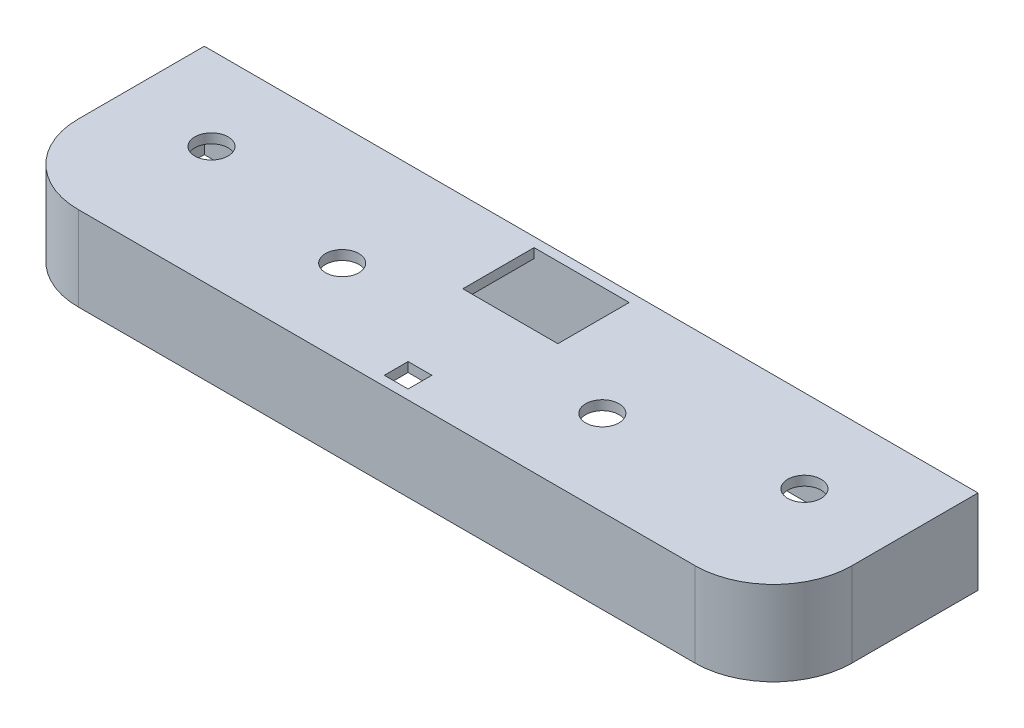
ISO-10303-21;
HEADER;
FILE_DESCRIPTION(('STEP AP214'),'2;1');
FILE_NAME('part.step','',(''),(''),'','','');
FILE_SCHEMA(('AUTOMOTIVE_DESIGN { 1 0 10303 214 1 1 1 1 }'));
ENDSEC;
DATA;
#1=APPLICATION_CONTEXT('core data for automotive mechanical design processes');
#2=APPLICATION_PROTOCOL_DEFINITION('international standard','automotive_design',2000,#1);
#3=PRODUCT_CONTEXT('',#1,'mechanical');
#4=PRODUCT('Part','Part','',(#3));
#5=PRODUCT_RELATED_PRODUCT_CATEGORY('part','',(#4));
#6=PRODUCT_DEFINITION_FORMATION('','',#4);
#7=PRODUCT_DEFINITION_CONTEXT('part definition',#1,'design');
#8=PRODUCT_DEFINITION('design','',#6,#7);
#9=PRODUCT_DEFINITION_SHAPE('','',#8);
#10=(LENGTH_UNIT() NAMED_UNIT(*) SI_UNIT(.MILLI.,.METRE.));
#11=(NAMED_UNIT(*) PLANE_ANGLE_UNIT() SI_UNIT($,.RADIAN.));
#12=(NAMED_UNIT(*) SI_UNIT($,.STERADIAN.) SOLID_ANGLE_UNIT());
#13=UNCERTAINTY_MEASURE_WITH_UNIT(LENGTH_MEASURE(1.E-05),#10,'distance_accuracy_value','');
#14=(GEOMETRIC_REPRESENTATION_CONTEXT(3) GLOBAL_UNCERTAINTY_ASSIGNED_CONTEXT((#13)) GLOBAL_UNIT_ASSIGNED_CONTEXT((#10,
#11,#12)) REPRESENTATION_CONTEXT('',''));
#15=CARTESIAN_POINT('',(0.,0.,0.));
#16=DIRECTION('',(0.,0.,1.));
#17=DIRECTION('',(1.,0.,0.));
#18=AXIS2_PLACEMENT_3D('',#15,#16,#17);
#19=CARTESIAN_POINT('',(0.,0.,0.));
#20=DIRECTION('',(0.,-1.,0.));
#21=DIRECTION('',(0.,0.,-1.));
#22=AXIS2_PLACEMENT_3D('',#19,#20,#21);
#23=PLANE('',#22);
#24=DIRECTION('',(0.,0.,-1.));
#25=VECTOR('',#24,1.);
#26=CARTESIAN_POINT('',(81.35,0.,21.5));
#27=LINE('',#26,#25);
#28=CARTESIAN_POINT('',(81.35,0.,5.));
#29=VERTEX_POINT('',#28);
#30=CARTESIAN_POINT('',(81.35,0.,-21.5));
#31=VERTEX_POINT('',#30);
#32=EDGE_CURVE('E259',#29,#31,#27,.T.);
#33=ORIENTED_EDGE('',*,*,#32,.F.);
#34=CARTESIAN_POINT('',(64.85,0.,5.));
#35=DIRECTION('',(0.,-1.,0.));
#36=DIRECTION('',(0.,0.,-1.));
#37=AXIS2_PLACEMENT_3D('',#34,#35,#36);
#38=CIRCLE('',#37,16.5);
#39=CARTESIAN_POINT('',(64.85,0.,21.5));
#40=VERTEX_POINT('',#39);
#41=EDGE_CURVE('E317',#29,#40,#38,.T.);
#42=ORIENTED_EDGE('',*,*,#41,.T.);
#43=DIRECTION('',(1.,0.,0.));
#44=VECTOR('',#43,1.);
#45=CARTESIAN_POINT('',(-81.35,0.,21.5));
#46=LINE('',#45,#44);
#47=CARTESIAN_POINT('',(-64.85,0.,21.5));
#48=VERTEX_POINT('',#47);
#49=EDGE_CURVE('E290',#48,#40,#46,.T.);
#50=ORIENTED_EDGE('',*,*,#49,.F.);
#51=CARTESIAN_POINT('',(-64.85,0.,5.));
#52=DIRECTION('',(0.,-1.,0.));
#53=DIRECTION('',(0.,0.,-1.));
#54=AXIS2_PLACEMENT_3D('',#51,#52,#53);
#55=CIRCLE('',#54,16.5);
#56=CARTESIAN_POINT('',(-81.35,0.,5.));
#57=VERTEX_POINT('',#56);
#58=EDGE_CURVE('E315',#48,#57,#55,.T.);
#59=ORIENTED_EDGE('',*,*,#58,.T.);
#60=DIRECTION('',(0.,0.,1.));
#61=VECTOR('',#60,1.);
#62=CARTESIAN_POINT('',(-81.35,0.,21.5));
#63=LINE('',#62,#61);
#64=CARTESIAN_POINT('',(-81.35,0.,-21.5));
#65=VERTEX_POINT('',#64);
#66=EDGE_CURVE('E302',#65,#57,#63,.T.);
#67=ORIENTED_EDGE('',*,*,#66,.F.);
#68=DIRECTION('',(-1.,0.,0.));
#69=VECTOR('',#68,1.);
#70=CARTESIAN_POINT('',(-81.35,0.,-21.5));
#71=LINE('',#70,#69);
#72=EDGE_CURVE('E300',#31,#65,#71,.T.);
#73=ORIENTED_EDGE('',*,*,#72,.F.);
#74=EDGE_LOOP('',(#33,#42,#50,#59,#67,#73));
#75=FACE_BOUND('',#74,.T.);
#76=CARTESIAN_POINT('',(64.85,0.,5.));
#77=DIRECTION('',(0.,-1.,0.));
#78=DIRECTION('',(0.,0.,-1.));
#79=AXIS2_PLACEMENT_3D('',#76,#77,#78);
#80=CIRCLE('',#79,14.5);
#81=CARTESIAN_POINT('',(79.35,0.,5.));
#82=VERTEX_POINT('',#81);
#83=CARTESIAN_POINT('',(64.85,0.,19.5));
#84=VERTEX_POINT('',#83);
#85=EDGE_CURVE('E273',#82,#84,#80,.T.);
#86=ORIENTED_EDGE('',*,*,#85,.F.);
#87=DIRECTION('',(0.,0.,-1.));
#88=VECTOR('',#87,1.);
#89=CARTESIAN_POINT('',(79.35,0.,0.));
#90=LINE('',#89,#88);
#91=CARTESIAN_POINT('',(79.35,0.,-19.5));
#92=VERTEX_POINT('',#91);
#93=EDGE_CURVE('E274',#82,#92,#90,.T.);
#94=ORIENTED_EDGE('',*,*,#93,.T.);
#95=DIRECTION('',(-1.,0.,0.));
#96=VECTOR('',#95,1.);
#97=CARTESIAN_POINT('',(0.,0.,-19.5));
#98=LINE('',#97,#96);
#99=CARTESIAN_POINT('',(-79.35,0.,-19.5));
#100=VERTEX_POINT('',#99);
#101=EDGE_CURVE('E277',#92,#100,#98,.T.);
#102=ORIENTED_EDGE('',*,*,#101,.T.);
#103=DIRECTION('',(0.,0.,1.));
#104=VECTOR('',#103,1.);
#105=CARTESIAN_POINT('',(-79.35,0.,0.));
#106=LINE('',#105,#104);
#107=CARTESIAN_POINT('',(-79.35,0.,5.));
#108=VERTEX_POINT('',#107);
#109=EDGE_CURVE('E282',#100,#108,#106,.T.);
#110=ORIENTED_EDGE('',*,*,#109,.T.);
#111=CARTESIAN_POINT('',(-64.85,0.,5.));
#112=DIRECTION('',(0.,-1.,0.));
#113=DIRECTION('',(0.,0.,-1.));
#114=AXIS2_PLACEMENT_3D('',#111,#112,#113);
#115=CIRCLE('',#114,14.5);
#116=CARTESIAN_POINT('',(-64.85,0.,19.5));
#117=VERTEX_POINT('',#116);
#118=EDGE_CURVE('E245',#117,#108,#115,.T.);
#119=ORIENTED_EDGE('',*,*,#118,.F.);
#120=DIRECTION('',(1.,0.,0.));
#121=VECTOR('',#120,1.);
#122=CARTESIAN_POINT('',(0.,0.,19.5));
#123=LINE('',#122,#121);
#124=EDGE_CURVE('E242',#117,#84,#123,.T.);
#125=ORIENTED_EDGE('',*,*,#124,.T.);
#126=EDGE_LOOP('',(#86,#94,#102,#110,#119,#125));
#127=FACE_BOUND('',#126,.T.);
#128=ADVANCED_FACE('F41',(#75,#127),#23,.T.);
#129=CARTESIAN_POINT('',(81.35,17.75,21.5));
#130=DIRECTION('',(-1.,0.,0.));
#131=DIRECTION('',(0.,0.,1.));
#132=AXIS2_PLACEMENT_3D('',#129,#130,#131);
#133=PLANE('',#132);
#134=DIRECTION('',(0.,0.,-1.));
#135=VECTOR('',#134,1.);
#136=CARTESIAN_POINT('',(81.35,17.75,21.5));
#137=LINE('',#136,#135);
#138=CARTESIAN_POINT('',(81.35,17.75,5.));
#139=VERTEX_POINT('',#138);
#140=CARTESIAN_POINT('',(81.35,17.75,-21.5));
#141=VERTEX_POINT('',#140);
#142=EDGE_CURVE('E287',#139,#141,#137,.T.);
#143=ORIENTED_EDGE('',*,*,#142,.F.);
#144=DIRECTION('',(0.,-1.,0.));
#145=VECTOR('',#144,1.);
#146=CARTESIAN_POINT('',(81.35,17.75,5.));
#147=LINE('',#146,#145);
#148=EDGE_CURVE('E312',#139,#29,#147,.T.);
#149=ORIENTED_EDGE('',*,*,#148,.T.);
#150=ORIENTED_EDGE('',*,*,#32,.T.);
#151=DIRECTION('',(0.,-1.,0.));
#152=VECTOR('',#151,1.);
#153=CARTESIAN_POINT('',(81.35,17.75,-21.5));
#154=LINE('',#153,#152);
#155=EDGE_CURVE('E309',#141,#31,#154,.T.);
#156=ORIENTED_EDGE('',*,*,#155,.F.);
#157=EDGE_LOOP('',(#143,#149,#150,#156));
#158=FACE_BOUND('',#157,.T.);
#159=ADVANCED_FACE('F388',(#158),#133,.F.);
#160=CARTESIAN_POINT('',(-81.35,17.75,-21.5));
#161=DIRECTION('',(0.,0.,1.));
#162=DIRECTION('',(1.,0.,0.));
#163=AXIS2_PLACEMENT_3D('',#160,#161,#162);
#164=PLANE('',#163);
#165=ORIENTED_EDGE('',*,*,#72,.T.);
#166=DIRECTION('',(0.,-1.,0.));
#167=VECTOR('',#166,1.);
#168=CARTESIAN_POINT('',(-81.35,17.75,-21.5));
#169=LINE('',#168,#167);
#170=CARTESIAN_POINT('',(-81.35,17.75,-21.5));
#171=VERTEX_POINT('',#170);
#172=EDGE_CURVE('E298',#171,#65,#169,.T.);
#173=ORIENTED_EDGE('',*,*,#172,.F.);
#174=DIRECTION('',(-1.,0.,0.));
#175=VECTOR('',#174,1.);
#176=CARTESIAN_POINT('',(-81.35,17.75,-21.5));
#177=LINE('',#176,#175);
#178=EDGE_CURVE('E289',#141,#171,#177,.T.);
#179=ORIENTED_EDGE('',*,*,#178,.F.);
#180=ORIENTED_EDGE('',*,*,#155,.T.);
#181=EDGE_LOOP('',(#165,#173,#179,#180));
#182=FACE_BOUND('',#181,.T.);
#183=ADVANCED_FACE('F395',(#182),#164,.F.);
#184=CARTESIAN_POINT('',(-81.35,17.75,21.5));
#185=DIRECTION('',(1.,0.,0.));
#186=DIRECTION('',(0.,0.,-1.));
#187=AXIS2_PLACEMENT_3D('',#184,#185,#186);
#188=PLANE('',#187);
#189=ORIENTED_EDGE('',*,*,#66,.T.);
#190=DIRECTION('',(0.,-1.,0.));
#191=VECTOR('',#190,1.);
#192=CARTESIAN_POINT('',(-81.35,17.75,5.));
#193=LINE('',#192,#191);
#194=CARTESIAN_POINT('',(-81.35,17.75,5.));
#195=VERTEX_POINT('',#194);
#196=EDGE_CURVE('E328',#57,#195,#193,.F.);
#197=ORIENTED_EDGE('',*,*,#196,.T.);
#198=DIRECTION('',(0.,0.,1.));
#199=VECTOR('',#198,1.);
#200=CARTESIAN_POINT('',(-81.35,17.75,21.5));
#201=LINE('',#200,#199);
#202=EDGE_CURVE('E292',#171,#195,#201,.T.);
#203=ORIENTED_EDGE('',*,*,#202,.F.);
#204=ORIENTED_EDGE('',*,*,#172,.T.);
#205=EDGE_LOOP('',(#189,#197,#203,#204));
#206=FACE_BOUND('',#205,.T.);
#207=ADVANCED_FACE('F405',(#206),#188,.F.);
#208=CARTESIAN_POINT('',(-81.35,17.75,21.5));
#209=DIRECTION('',(0.,0.,-1.));
#210=DIRECTION('',(-1.,0.,0.));
#211=AXIS2_PLACEMENT_3D('',#208,#209,#210);
#212=PLANE('',#211);
#213=ORIENTED_EDGE('',*,*,#49,.T.);
#214=DIRECTION('',(0.,-1.,0.));
#215=VECTOR('',#214,1.);
#216=CARTESIAN_POINT('',(64.85,17.75,21.5));
#217=LINE('',#216,#215);
#218=CARTESIAN_POINT('',(64.85,17.75,21.5));
#219=VERTEX_POINT('',#218);
#220=EDGE_CURVE('E322',#40,#219,#217,.F.);
#221=ORIENTED_EDGE('',*,*,#220,.T.);
#222=DIRECTION('',(1.,0.,0.));
#223=VECTOR('',#222,1.);
#224=CARTESIAN_POINT('',(-81.35,17.75,21.5));
#225=LINE('',#224,#223);
#226=CARTESIAN_POINT('',(-64.85,17.75,21.5));
#227=VERTEX_POINT('',#226);
#228=EDGE_CURVE('E295',#227,#219,#225,.T.);
#229=ORIENTED_EDGE('',*,*,#228,.F.);
#230=DIRECTION('',(0.,-1.,0.));
#231=VECTOR('',#230,1.);
#232=CARTESIAN_POINT('',(-64.85,17.75,21.5));
#233=LINE('',#232,#231);
#234=EDGE_CURVE('E319',#227,#48,#233,.T.);
#235=ORIENTED_EDGE('',*,*,#234,.T.);
#236=EDGE_LOOP('',(#213,#221,#229,#235));
#237=FACE_BOUND('',#236,.T.);
#238=ADVANCED_FACE('F402',(#237),#212,.F.);
#239=CARTESIAN_POINT('',(0.,17.75,0.));
#240=DIRECTION('',(0.,-1.,0.));
#241=DIRECTION('',(0.,0.,-1.));
#242=AXIS2_PLACEMENT_3D('',#239,#240,#241);
#243=PLANE('',#242);
#244=DIRECTION('',(1.,0.,0.));
#245=VECTOR('',#244,1.);
#246=CARTESIAN_POINT('',(-2.50000000000001,17.75,19.5));
#247=LINE('',#246,#245);
#248=CARTESIAN_POINT('',(-2.50000000000001,17.75,19.5));
#249=VERTEX_POINT('',#248);
#250=CARTESIAN_POINT('',(2.49999999999999,17.75,19.5));
#251=VERTEX_POINT('',#250);
#252=EDGE_CURVE('E188',#249,#251,#247,.T.);
#253=ORIENTED_EDGE('',*,*,#252,.F.);
#254=DIRECTION('',(0.,0.,1.));
#255=VECTOR('',#254,1.);
#256=CARTESIAN_POINT('',(-2.50000000000001,17.75,14.5));
#257=LINE('',#256,#255);
#258=CARTESIAN_POINT('',(-2.50000000000001,17.75,14.5));
#259=VERTEX_POINT('',#258);
#260=EDGE_CURVE('E56',#259,#249,#257,.T.);
#261=ORIENTED_EDGE('',*,*,#260,.F.);
#262=DIRECTION('',(-1.,0.,0.));
#263=VECTOR('',#262,1.);
#264=CARTESIAN_POINT('',(-2.50000000000001,17.75,14.5));
#265=LINE('',#264,#263);
#266=CARTESIAN_POINT('',(2.49999999999999,17.75,14.5));
#267=VERTEX_POINT('',#266);
#268=EDGE_CURVE('E197',#267,#259,#265,.T.);
#269=ORIENTED_EDGE('',*,*,#268,.F.);
#270=DIRECTION('',(0.,0.,-1.));
#271=VECTOR('',#270,1.);
#272=CARTESIAN_POINT('',(2.49999999999999,17.75,14.5));
#273=LINE('',#272,#271);
#274=EDGE_CURVE('E179',#251,#267,#273,.T.);
#275=ORIENTED_EDGE('',*,*,#274,.F.);
#276=EDGE_LOOP('',(#253,#261,#269,#275));
#277=FACE_BOUND('',#276,.T.);
#278=DIRECTION('',(1.,0.,0.));
#279=VECTOR('',#278,1.);
#280=CARTESIAN_POINT('',(-10.,17.75,-4.5));
#281=LINE('',#280,#279);
#282=CARTESIAN_POINT('',(-10.,17.75,-4.5));
#283=VERTEX_POINT('',#282);
#284=CARTESIAN_POINT('',(10.,17.75,-4.5));
#285=VERTEX_POINT('',#284);
#286=EDGE_CURVE('E208',#283,#285,#281,.T.);
#287=ORIENTED_EDGE('',*,*,#286,.F.);
#288=DIRECTION('',(0.,0.,1.));
#289=VECTOR('',#288,1.);
#290=CARTESIAN_POINT('',(-10.,17.75,-19.5));
#291=LINE('',#290,#289);
#292=CARTESIAN_POINT('',(-10.,17.75,-19.5));
#293=VERTEX_POINT('',#292);
#294=EDGE_CURVE('E204',#293,#283,#291,.T.);
#295=ORIENTED_EDGE('',*,*,#294,.F.);
#296=DIRECTION('',(-1.,0.,0.));
#297=VECTOR('',#296,1.);
#298=CARTESIAN_POINT('',(-10.,17.75,-19.5));
#299=LINE('',#298,#297);
#300=CARTESIAN_POINT('',(10.,17.75,-19.5));
#301=VERTEX_POINT('',#300);
#302=EDGE_CURVE('E214',#301,#293,#299,.T.);
#303=ORIENTED_EDGE('',*,*,#302,.F.);
#304=DIRECTION('',(0.,0.,-1.));
#305=VECTOR('',#304,1.);
#306=CARTESIAN_POINT('',(10.,17.75,-19.5));
#307=LINE('',#306,#305);
#308=EDGE_CURVE('E211',#285,#301,#307,.T.);
#309=ORIENTED_EDGE('',*,*,#308,.F.);
#310=EDGE_LOOP('',(#287,#295,#303,#309));
#311=FACE_BOUND('',#310,.T.);
#312=CARTESIAN_POINT('',(-62.35,17.75,-4.));
#313=DIRECTION('',(0.,1.,0.));
#314=DIRECTION('',(0.,0.,1.));
#315=AXIS2_PLACEMENT_3D('',#312,#313,#314);
#316=CIRCLE('',#315,3.5);
#317=CARTESIAN_POINT('',(-62.35,17.75,-0.5));
#318=VERTEX_POINT('',#317);
#319=EDGE_CURVE('E227',#318,#318,#316,.T.);
#320=ORIENTED_EDGE('',*,*,#319,.F.);
#321=EDGE_LOOP('',(#320));
#322=FACE_BOUND('',#321,.T.);
#323=CARTESIAN_POINT('',(-27.35,17.75,3.5));
#324=DIRECTION('',(0.,1.,0.));
#325=DIRECTION('',(0.,0.,1.));
#326=AXIS2_PLACEMENT_3D('',#323,#324,#325);
#327=CIRCLE('',#326,3.5);
#328=CARTESIAN_POINT('',(-27.35,17.75,7.));
#329=VERTEX_POINT('',#328);
#330=EDGE_CURVE('E231',#329,#329,#327,.T.);
#331=ORIENTED_EDGE('',*,*,#330,.F.);
#332=EDGE_LOOP('',(#331));
#333=FACE_BOUND('',#332,.T.);
#334=CARTESIAN_POINT('',(27.35,17.75,3.5));
#335=DIRECTION('',(0.,1.,0.));
#336=DIRECTION('',(0.,0.,-1.));
#337=AXIS2_PLACEMENT_3D('',#334,#335,#336);
#338=CIRCLE('',#337,3.5);
#339=CARTESIAN_POINT('',(27.35,17.75,0.));
#340=VERTEX_POINT('',#339);
#341=EDGE_CURVE('E234',#340,#340,#338,.T.);
#342=ORIENTED_EDGE('',*,*,#341,.F.);
#343=EDGE_LOOP('',(#342));
#344=FACE_BOUND('',#343,.T.);
#345=CARTESIAN_POINT('',(62.35,17.75,-4.));
#346=DIRECTION('',(0.,1.,0.));
#347=DIRECTION('',(0.,0.,-1.));
#348=AXIS2_PLACEMENT_3D('',#345,#346,#347);
#349=CIRCLE('',#348,3.5);
#350=CARTESIAN_POINT('',(62.35,17.75,-7.5));
#351=VERTEX_POINT('',#350);
#352=EDGE_CURVE('E220',#351,#351,#349,.T.);
#353=ORIENTED_EDGE('',*,*,#352,.F.);
#354=EDGE_LOOP('',(#353));
#355=FACE_BOUND('',#354,.T.);
#356=ORIENTED_EDGE('',*,*,#228,.T.);
#357=CARTESIAN_POINT('',(64.85,17.75,5.));
#358=DIRECTION('',(0.,-1.,0.));
#359=DIRECTION('',(0.,0.,-1.));
#360=AXIS2_PLACEMENT_3D('',#357,#358,#359);
#361=CIRCLE('',#360,16.5);
#362=EDGE_CURVE('E326',#219,#139,#361,.F.);
#363=ORIENTED_EDGE('',*,*,#362,.T.);
#364=ORIENTED_EDGE('',*,*,#142,.T.);
#365=ORIENTED_EDGE('',*,*,#178,.T.);
#366=ORIENTED_EDGE('',*,*,#202,.T.);
#367=CARTESIAN_POINT('',(-64.85,17.75,5.));
#368=DIRECTION('',(0.,-1.,0.));
#369=DIRECTION('',(0.,0.,-1.));
#370=AXIS2_PLACEMENT_3D('',#367,#368,#369);
#371=CIRCLE('',#370,16.5);
#372=EDGE_CURVE('E324',#195,#227,#371,.F.);
#373=ORIENTED_EDGE('',*,*,#372,.T.);
#374=EDGE_LOOP('',(#356,#363,#364,#365,#366,#373));
#375=FACE_BOUND('',#374,.T.);
#376=ADVANCED_FACE('F194',(#277,#311,#322,#333,#344,#355,#375),#243,.F.);
#377=CARTESIAN_POINT('',(64.85,17.75,5.));
#378=DIRECTION('',(0.,-1.,0.));
#379=DIRECTION('',(0.,0.,-1.));
#380=AXIS2_PLACEMENT_3D('',#377,#378,#379);
#381=CYLINDRICAL_SURFACE('',#380,16.5);
#382=ORIENTED_EDGE('',*,*,#362,.F.);
#383=ORIENTED_EDGE('',*,*,#220,.F.);
#384=ORIENTED_EDGE('',*,*,#41,.F.);
#385=ORIENTED_EDGE('',*,*,#148,.F.);
#386=EDGE_LOOP('',(#382,#383,#384,#385));
#387=FACE_BOUND('',#386,.T.);
#388=ADVANCED_FACE('F412',(#387),#381,.T.);
#389=CARTESIAN_POINT('',(-64.85,17.75,5.));
#390=DIRECTION('',(0.,-1.,0.));
#391=DIRECTION('',(0.,0.,-1.));
#392=AXIS2_PLACEMENT_3D('',#389,#390,#391);
#393=CYLINDRICAL_SURFACE('',#392,16.5);
#394=ORIENTED_EDGE('',*,*,#372,.F.);
#395=ORIENTED_EDGE('',*,*,#196,.F.);
#396=ORIENTED_EDGE('',*,*,#58,.F.);
#397=ORIENTED_EDGE('',*,*,#234,.F.);
#398=EDGE_LOOP('',(#394,#395,#396,#397));
#399=FACE_BOUND('',#398,.T.);
#400=ADVANCED_FACE('F43',(#399),#393,.T.);
#401=CARTESIAN_POINT('',(79.35,17.75,21.5));
#402=DIRECTION('',(-1.,0.,0.));
#403=DIRECTION('',(0.,0.,1.));
#404=AXIS2_PLACEMENT_3D('',#401,#402,#403);
#405=PLANE('',#404);
#406=DIRECTION('',(0.,0.,-1.));
#407=VECTOR('',#406,1.);
#408=CARTESIAN_POINT('',(79.35,15.75,0.));
#409=LINE('',#408,#407);
#410=CARTESIAN_POINT('',(79.35,15.75,5.));
#411=VERTEX_POINT('',#410);
#412=CARTESIAN_POINT('',(79.35,15.75,-19.5));
#413=VERTEX_POINT('',#412);
#414=EDGE_CURVE('E239',#411,#413,#409,.T.);
#415=ORIENTED_EDGE('',*,*,#414,.T.);
#416=DIRECTION('',(0.,-1.,0.));
#417=VECTOR('',#416,1.);
#418=CARTESIAN_POINT('',(79.35,17.75,-19.5));
#419=LINE('',#418,#417);
#420=EDGE_CURVE('E246',#413,#92,#419,.T.);
#421=ORIENTED_EDGE('',*,*,#420,.T.);
#422=ORIENTED_EDGE('',*,*,#93,.F.);
#423=DIRECTION('',(0.,1.,0.));
#424=VECTOR('',#423,1.);
#425=CARTESIAN_POINT('',(79.35,17.75,5.));
#426=LINE('',#425,#424);
#427=EDGE_CURVE('E243',#411,#82,#426,.F.);
#428=ORIENTED_EDGE('',*,*,#427,.F.);
#429=EDGE_LOOP('',(#415,#421,#422,#428));
#430=FACE_BOUND('',#429,.T.);
#431=ADVANCED_FACE('F418',(#430),#405,.T.);
#432=CARTESIAN_POINT('',(-81.35,17.75,-19.5));
#433=DIRECTION('',(0.,0.,1.));
#434=DIRECTION('',(1.,0.,0.));
#435=AXIS2_PLACEMENT_3D('',#432,#433,#434);
#436=PLANE('',#435);
#437=DIRECTION('',(-1.,0.,0.));
#438=VECTOR('',#437,1.);
#439=CARTESIAN_POINT('',(0.,15.75,-19.5));
#440=LINE('',#439,#438);
#441=CARTESIAN_POINT('',(10.,15.75,-19.5));
#442=VERTEX_POINT('',#441);
#443=EDGE_CURVE('E253',#413,#442,#440,.T.);
#444=ORIENTED_EDGE('',*,*,#443,.T.);
#445=DIRECTION('',(0.,1.,0.));
#446=VECTOR('',#445,1.);
#447=CARTESIAN_POINT('',(10.,0.,-19.5));
#448=LINE('',#447,#446);
#449=EDGE_CURVE('E221',#442,#301,#448,.T.);
#450=ORIENTED_EDGE('',*,*,#449,.T.);
#451=ORIENTED_EDGE('',*,*,#302,.T.);
#452=DIRECTION('',(0.,1.,0.));
#453=VECTOR('',#452,1.);
#454=CARTESIAN_POINT('',(-10.,0.,-19.5));
#455=LINE('',#454,#453);
#456=CARTESIAN_POINT('',(-10.,15.75,-19.5));
#457=VERTEX_POINT('',#456);
#458=EDGE_CURVE('E218',#457,#293,#455,.T.);
#459=ORIENTED_EDGE('',*,*,#458,.F.);
#460=CARTESIAN_POINT('',(-79.35,15.75,-19.5));
#461=VERTEX_POINT('',#460);
#462=EDGE_CURVE('E241',#457,#461,#440,.T.);
#463=ORIENTED_EDGE('',*,*,#462,.T.);
#464=DIRECTION('',(0.,-1.,0.));
#465=VECTOR('',#464,1.);
#466=CARTESIAN_POINT('',(-79.35,17.75,-19.5));
#467=LINE('',#466,#465);
#468=EDGE_CURVE('E249',#461,#100,#467,.T.);
#469=ORIENTED_EDGE('',*,*,#468,.T.);
#470=ORIENTED_EDGE('',*,*,#101,.F.);
#471=ORIENTED_EDGE('',*,*,#420,.F.);
#472=EDGE_LOOP('',(#444,#450,#451,#459,#463,#469,#470,#471));
#473=FACE_BOUND('',#472,.T.);
#474=ADVANCED_FACE('F522',(#473),#436,.T.);
#475=CARTESIAN_POINT('',(-79.35,17.75,21.5));
#476=DIRECTION('',(1.,0.,0.));
#477=DIRECTION('',(0.,0.,-1.));
#478=AXIS2_PLACEMENT_3D('',#475,#476,#477);
#479=PLANE('',#478);
#480=ORIENTED_EDGE('',*,*,#109,.F.);
#481=ORIENTED_EDGE('',*,*,#468,.F.);
#482=DIRECTION('',(0.,0.,1.));
#483=VECTOR('',#482,1.);
#484=CARTESIAN_POINT('',(-79.35,15.75,0.));
#485=LINE('',#484,#483);
#486=CARTESIAN_POINT('',(-79.35,15.75,5.));
#487=VERTEX_POINT('',#486);
#488=EDGE_CURVE('E256',#461,#487,#485,.T.);
#489=ORIENTED_EDGE('',*,*,#488,.T.);
#490=DIRECTION('',(0.,1.,0.));
#491=VECTOR('',#490,1.);
#492=CARTESIAN_POINT('',(-79.35,17.75,5.));
#493=LINE('',#492,#491);
#494=EDGE_CURVE('E257',#108,#487,#493,.T.);
#495=ORIENTED_EDGE('',*,*,#494,.F.);
#496=EDGE_LOOP('',(#480,#481,#489,#495));
#497=FACE_BOUND('',#496,.T.);
#498=ADVANCED_FACE('F445',(#497),#479,.T.);
#499=CARTESIAN_POINT('',(-81.35,17.75,19.5));
#500=DIRECTION('',(0.,0.,-1.));
#501=DIRECTION('',(-1.,0.,0.));
#502=AXIS2_PLACEMENT_3D('',#499,#500,#501);
#503=PLANE('',#502);
#504=DIRECTION('',(0.,1.,0.));
#505=VECTOR('',#504,1.);
#506=CARTESIAN_POINT('',(64.85,17.75,19.5));
#507=LINE('',#506,#505);
#508=CARTESIAN_POINT('',(64.85,15.75,19.5));
#509=VERTEX_POINT('',#508);
#510=EDGE_CURVE('E268',#84,#509,#507,.T.);
#511=ORIENTED_EDGE('',*,*,#510,.F.);
#512=ORIENTED_EDGE('',*,*,#124,.F.);
#513=DIRECTION('',(0.,1.,0.));
#514=VECTOR('',#513,1.);
#515=CARTESIAN_POINT('',(-64.85,17.75,19.5));
#516=LINE('',#515,#514);
#517=CARTESIAN_POINT('',(-64.85,15.75,19.5));
#518=VERTEX_POINT('',#517);
#519=EDGE_CURVE('E271',#518,#117,#516,.F.);
#520=ORIENTED_EDGE('',*,*,#519,.F.);
#521=DIRECTION('',(1.,0.,0.));
#522=VECTOR('',#521,1.);
#523=CARTESIAN_POINT('',(0.,15.75,19.5));
#524=LINE('',#523,#522);
#525=CARTESIAN_POINT('',(-2.50000000000001,15.75,19.5));
#526=VERTEX_POINT('',#525);
#527=EDGE_CURVE('E252',#518,#526,#524,.T.);
#528=ORIENTED_EDGE('',*,*,#527,.T.);
#529=DIRECTION('',(0.,1.,0.));
#530=VECTOR('',#529,1.);
#531=CARTESIAN_POINT('',(-2.50000000000001,0.,19.5));
#532=LINE('',#531,#530);
#533=EDGE_CURVE('E185',#526,#249,#532,.T.);
#534=ORIENTED_EDGE('',*,*,#533,.T.);
#535=ORIENTED_EDGE('',*,*,#252,.T.);
#536=DIRECTION('',(0.,1.,0.));
#537=VECTOR('',#536,1.);
#538=CARTESIAN_POINT('',(2.49999999999999,0.,19.5));
#539=LINE('',#538,#537);
#540=CARTESIAN_POINT('',(2.49999999999999,15.75,19.5));
#541=VERTEX_POINT('',#540);
#542=EDGE_CURVE('E64',#541,#251,#539,.T.);
#543=ORIENTED_EDGE('',*,*,#542,.F.);
#544=EDGE_CURVE('E263',#541,#509,#524,.T.);
#545=ORIENTED_EDGE('',*,*,#544,.T.);
#546=EDGE_LOOP('',(#511,#512,#520,#528,#534,#535,#543,#545));
#547=FACE_BOUND('',#546,.T.);
#548=ADVANCED_FACE('F190',(#547),#503,.T.);
#549=CARTESIAN_POINT('',(0.,15.75,0.));
#550=DIRECTION('',(0.,-1.,0.));
#551=DIRECTION('',(0.,0.,-1.));
#552=AXIS2_PLACEMENT_3D('',#549,#550,#551);
#553=PLANE('',#552);
#554=DIRECTION('',(0.,0.,-1.));
#555=VECTOR('',#554,1.);
#556=CARTESIAN_POINT('',(-2.50000000000001,15.75,0.));
#557=LINE('',#556,#555);
#558=CARTESIAN_POINT('',(-2.50000000000001,15.75,14.5));
#559=VERTEX_POINT('',#558);
#560=EDGE_CURVE('E11',#526,#559,#557,.T.);
#561=ORIENTED_EDGE('',*,*,#560,.F.);
#562=ORIENTED_EDGE('',*,*,#527,.F.);
#563=CARTESIAN_POINT('',(-64.85,15.75,5.));
#564=DIRECTION('',(0.,-1.,0.));
#565=DIRECTION('',(0.,0.,-1.));
#566=AXIS2_PLACEMENT_3D('',#563,#564,#565);
#567=CIRCLE('',#566,14.5);
#568=EDGE_CURVE('E266',#487,#518,#567,.F.);
#569=ORIENTED_EDGE('',*,*,#568,.F.);
#570=ORIENTED_EDGE('',*,*,#488,.F.);
#571=ORIENTED_EDGE('',*,*,#462,.F.);
#572=DIRECTION('',(0.,0.,-1.));
#573=VECTOR('',#572,1.);
#574=CARTESIAN_POINT('',(-10.,15.75,0.));
#575=LINE('',#574,#573);
#576=CARTESIAN_POINT('',(-10.,15.75,-4.5));
#577=VERTEX_POINT('',#576);
#578=EDGE_CURVE('E345',#577,#457,#575,.T.);
#579=ORIENTED_EDGE('',*,*,#578,.F.);
#580=DIRECTION('',(-1.,0.,0.));
#581=VECTOR('',#580,1.);
#582=CARTESIAN_POINT('',(0.,15.75,-4.5));
#583=LINE('',#582,#581);
#584=CARTESIAN_POINT('',(10.,15.75,-4.5));
#585=VERTEX_POINT('',#584);
#586=EDGE_CURVE('E330',#585,#577,#583,.T.);
#587=ORIENTED_EDGE('',*,*,#586,.F.);
#588=DIRECTION('',(0.,0.,1.));
#589=VECTOR('',#588,1.);
#590=CARTESIAN_POINT('',(10.,15.75,0.));
#591=LINE('',#590,#589);
#592=EDGE_CURVE('E342',#442,#585,#591,.T.);
#593=ORIENTED_EDGE('',*,*,#592,.F.);
#594=ORIENTED_EDGE('',*,*,#443,.F.);
#595=ORIENTED_EDGE('',*,*,#414,.F.);
#596=CARTESIAN_POINT('',(64.85,15.75,5.));
#597=DIRECTION('',(0.,-1.,0.));
#598=DIRECTION('',(0.,0.,-1.));
#599=AXIS2_PLACEMENT_3D('',#596,#597,#598);
#600=CIRCLE('',#599,14.5);
#601=EDGE_CURVE('E260',#509,#411,#600,.F.);
#602=ORIENTED_EDGE('',*,*,#601,.F.);
#603=ORIENTED_EDGE('',*,*,#544,.F.);
#604=DIRECTION('',(0.,0.,1.));
#605=VECTOR('',#604,1.);
#606=CARTESIAN_POINT('',(2.49999999999999,15.75,0.));
#607=LINE('',#606,#605);
#608=CARTESIAN_POINT('',(2.49999999999999,15.75,14.5));
#609=VERTEX_POINT('',#608);
#610=EDGE_CURVE('E182',#609,#541,#607,.T.);
#611=ORIENTED_EDGE('',*,*,#610,.F.);
#612=DIRECTION('',(1.,0.,0.));
#613=VECTOR('',#612,1.);
#614=CARTESIAN_POINT('',(0.,15.75,14.5));
#615=LINE('',#614,#613);
#616=EDGE_CURVE('E49',#559,#609,#615,.T.);
#617=ORIENTED_EDGE('',*,*,#616,.F.);
#618=EDGE_LOOP('',(#561,#562,#569,#570,#571,#579,#587,#593,#594,#595,#602,#603,#611,#617));
#619=FACE_BOUND('',#618,.T.);
#620=CARTESIAN_POINT('',(-62.35,15.75,-4.));
#621=DIRECTION('',(0.,-1.,0.));
#622=DIRECTION('',(0.,0.,-1.));
#623=AXIS2_PLACEMENT_3D('',#620,#621,#622);
#624=CIRCLE('',#623,3.5);
#625=CARTESIAN_POINT('',(-62.35,15.75,-7.5));
#626=VERTEX_POINT('',#625);
#627=EDGE_CURVE('E278',#626,#626,#624,.T.);
#628=ORIENTED_EDGE('',*,*,#627,.F.);
#629=EDGE_LOOP('',(#628));
#630=FACE_BOUND('',#629,.T.);
#631=CARTESIAN_POINT('',(-27.35,15.75,3.5));
#632=DIRECTION('',(0.,-1.,0.));
#633=DIRECTION('',(0.,0.,-1.));
#634=AXIS2_PLACEMENT_3D('',#631,#632,#633);
#635=CIRCLE('',#634,3.5);
#636=CARTESIAN_POINT('',(-27.35,15.75,0.));
#637=VERTEX_POINT('',#636);
#638=EDGE_CURVE('E336',#637,#637,#635,.T.);
#639=ORIENTED_EDGE('',*,*,#638,.F.);
#640=EDGE_LOOP('',(#639));
#641=FACE_BOUND('',#640,.T.);
#642=CARTESIAN_POINT('',(27.35,15.75,3.5));
#643=DIRECTION('',(0.,-1.,0.));
#644=DIRECTION('',(0.,0.,-1.));
#645=AXIS2_PLACEMENT_3D('',#642,#643,#644);
#646=CIRCLE('',#645,3.5);
#647=CARTESIAN_POINT('',(27.35,15.75,0.));
#648=VERTEX_POINT('',#647);
#649=EDGE_CURVE('E333',#648,#648,#646,.T.);
#650=ORIENTED_EDGE('',*,*,#649,.F.);
#651=EDGE_LOOP('',(#650));
#652=FACE_BOUND('',#651,.T.);
#653=CARTESIAN_POINT('',(62.35,15.75,-4.));
#654=DIRECTION('',(0.,-1.,0.));
#655=DIRECTION('',(0.,0.,-1.));
#656=AXIS2_PLACEMENT_3D('',#653,#654,#655);
#657=CIRCLE('',#656,3.5);
#658=CARTESIAN_POINT('',(62.35,15.75,-7.5));
#659=VERTEX_POINT('',#658);
#660=EDGE_CURVE('E230',#659,#659,#657,.T.);
#661=ORIENTED_EDGE('',*,*,#660,.F.);
#662=EDGE_LOOP('',(#661));
#663=FACE_BOUND('',#662,.T.);
#664=ADVANCED_FACE('F353',(#619,#630,#641,#652,#663),#553,.T.);
#665=CARTESIAN_POINT('',(64.85,17.75,5.));
#666=DIRECTION('',(0.,-1.,0.));
#667=DIRECTION('',(0.,0.,-1.));
#668=AXIS2_PLACEMENT_3D('',#665,#666,#667);
#669=CYLINDRICAL_SURFACE('',#668,14.5);
#670=ORIENTED_EDGE('',*,*,#601,.T.);
#671=ORIENTED_EDGE('',*,*,#427,.T.);
#672=ORIENTED_EDGE('',*,*,#85,.T.);
#673=ORIENTED_EDGE('',*,*,#510,.T.);
#674=EDGE_LOOP('',(#670,#671,#672,#673));
#675=FACE_BOUND('',#674,.T.);
#676=ADVANCED_FACE('F359',(#675),#669,.F.);
#677=CARTESIAN_POINT('',(-64.85,17.75,5.));
#678=DIRECTION('',(0.,-1.,0.));
#679=DIRECTION('',(0.,0.,-1.));
#680=AXIS2_PLACEMENT_3D('',#677,#678,#679);
#681=CYLINDRICAL_SURFACE('',#680,14.5);
#682=ORIENTED_EDGE('',*,*,#568,.T.);
#683=ORIENTED_EDGE('',*,*,#519,.T.);
#684=ORIENTED_EDGE('',*,*,#118,.T.);
#685=ORIENTED_EDGE('',*,*,#494,.T.);
#686=EDGE_LOOP('',(#682,#683,#684,#685));
#687=FACE_BOUND('',#686,.T.);
#688=ADVANCED_FACE('F368',(#687),#681,.F.);
#689=CARTESIAN_POINT('',(62.35,0.,-4.));
#690=DIRECTION('',(0.,1.,0.));
#691=DIRECTION('',(0.,0.,1.));
#692=AXIS2_PLACEMENT_3D('',#689,#690,#691);
#693=CYLINDRICAL_SURFACE('',#692,3.5);
#694=ORIENTED_EDGE('',*,*,#660,.T.);
#695=EDGE_LOOP('',(#694));
#696=FACE_BOUND('',#695,.T.);
#697=ORIENTED_EDGE('',*,*,#352,.T.);
#698=EDGE_LOOP('',(#697));
#699=FACE_BOUND('',#698,.T.);
#700=ADVANCED_FACE('F477',(#696,#699),#693,.F.);
#701=CARTESIAN_POINT('',(27.35,0.,3.5));
#702=DIRECTION('',(0.,1.,0.));
#703=DIRECTION('',(0.,0.,1.));
#704=AXIS2_PLACEMENT_3D('',#701,#702,#703);
#705=CYLINDRICAL_SURFACE('',#704,3.5);
#706=ORIENTED_EDGE('',*,*,#649,.T.);
#707=EDGE_LOOP('',(#706));
#708=FACE_BOUND('',#707,.T.);
#709=ORIENTED_EDGE('',*,*,#341,.T.);
#710=EDGE_LOOP('',(#709));
#711=FACE_BOUND('',#710,.T.);
#712=ADVANCED_FACE('F485',(#708,#711),#705,.F.);
#713=CARTESIAN_POINT('',(-27.35,0.,3.5));
#714=DIRECTION('',(0.,1.,0.));
#715=DIRECTION('',(0.,0.,1.));
#716=AXIS2_PLACEMENT_3D('',#713,#714,#715);
#717=CYLINDRICAL_SURFACE('',#716,3.5);
#718=ORIENTED_EDGE('',*,*,#638,.T.);
#719=EDGE_LOOP('',(#718));
#720=FACE_BOUND('',#719,.T.);
#721=ORIENTED_EDGE('',*,*,#330,.T.);
#722=EDGE_LOOP('',(#721));
#723=FACE_BOUND('',#722,.T.);
#724=ADVANCED_FACE('F495',(#720,#723),#717,.F.);
#725=CARTESIAN_POINT('',(-62.35,0.,-4.));
#726=DIRECTION('',(0.,1.,0.));
#727=DIRECTION('',(0.,0.,1.));
#728=AXIS2_PLACEMENT_3D('',#725,#726,#727);
#729=CYLINDRICAL_SURFACE('',#728,3.5);
#730=ORIENTED_EDGE('',*,*,#627,.T.);
#731=EDGE_LOOP('',(#730));
#732=FACE_BOUND('',#731,.T.);
#733=ORIENTED_EDGE('',*,*,#319,.T.);
#734=EDGE_LOOP('',(#733));
#735=FACE_BOUND('',#734,.T.);
#736=ADVANCED_FACE('F505',(#732,#735),#729,.F.);
#737=CARTESIAN_POINT('',(-10.,0.,-19.5));
#738=DIRECTION('',(-1.,0.,0.));
#739=DIRECTION('',(0.,0.,1.));
#740=AXIS2_PLACEMENT_3D('',#737,#738,#739);
#741=PLANE('',#740);
#742=ORIENTED_EDGE('',*,*,#578,.T.);
#743=ORIENTED_EDGE('',*,*,#458,.T.);
#744=ORIENTED_EDGE('',*,*,#294,.T.);
#745=DIRECTION('',(0.,1.,0.));
#746=VECTOR('',#745,1.);
#747=CARTESIAN_POINT('',(-10.,0.,-4.5));
#748=LINE('',#747,#746);
#749=EDGE_CURVE('E217',#577,#283,#748,.T.);
#750=ORIENTED_EDGE('',*,*,#749,.F.);
#751=EDGE_LOOP('',(#742,#743,#744,#750));
#752=FACE_BOUND('',#751,.T.);
#753=ADVANCED_FACE('F515',(#752),#741,.F.);
#754=CARTESIAN_POINT('',(10.,0.,-19.5));
#755=DIRECTION('',(1.,0.,0.));
#756=DIRECTION('',(0.,0.,-1.));
#757=AXIS2_PLACEMENT_3D('',#754,#755,#756);
#758=PLANE('',#757);
#759=ORIENTED_EDGE('',*,*,#592,.T.);
#760=DIRECTION('',(0.,1.,0.));
#761=VECTOR('',#760,1.);
#762=CARTESIAN_POINT('',(10.,0.,-4.5));
#763=LINE('',#762,#761);
#764=EDGE_CURVE('E223',#585,#285,#763,.T.);
#765=ORIENTED_EDGE('',*,*,#764,.T.);
#766=ORIENTED_EDGE('',*,*,#308,.T.);
#767=ORIENTED_EDGE('',*,*,#449,.F.);
#768=EDGE_LOOP('',(#759,#765,#766,#767));
#769=FACE_BOUND('',#768,.T.);
#770=ADVANCED_FACE('F382',(#769),#758,.F.);
#771=CARTESIAN_POINT('',(-10.,0.,-4.5));
#772=DIRECTION('',(0.,0.,1.));
#773=DIRECTION('',(1.,0.,0.));
#774=AXIS2_PLACEMENT_3D('',#771,#772,#773);
#775=PLANE('',#774);
#776=ORIENTED_EDGE('',*,*,#586,.T.);
#777=ORIENTED_EDGE('',*,*,#749,.T.);
#778=ORIENTED_EDGE('',*,*,#286,.T.);
#779=ORIENTED_EDGE('',*,*,#764,.F.);
#780=EDGE_LOOP('',(#776,#777,#778,#779));
#781=FACE_BOUND('',#780,.T.);
#782=ADVANCED_FACE('F374',(#781),#775,.F.);
#783=CARTESIAN_POINT('',(-2.50000000000001,0.,14.5));
#784=DIRECTION('',(-1.,0.,0.));
#785=DIRECTION('',(0.,0.,1.));
#786=AXIS2_PLACEMENT_3D('',#783,#784,#785);
#787=PLANE('',#786);
#788=ORIENTED_EDGE('',*,*,#560,.T.);
#789=DIRECTION('',(0.,1.,0.));
#790=VECTOR('',#789,1.);
#791=CARTESIAN_POINT('',(-2.50000000000001,0.,14.5));
#792=LINE('',#791,#790);
#793=EDGE_CURVE('E202',#559,#259,#792,.T.);
#794=ORIENTED_EDGE('',*,*,#793,.T.);
#795=ORIENTED_EDGE('',*,*,#260,.T.);
#796=ORIENTED_EDGE('',*,*,#533,.F.);
#797=EDGE_LOOP('',(#788,#794,#795,#796));
#798=FACE_BOUND('',#797,.T.);
#799=ADVANCED_FACE('F372',(#798),#787,.F.);
#800=CARTESIAN_POINT('',(-2.50000000000001,0.,14.5));
#801=DIRECTION('',(0.,0.,-1.));
#802=DIRECTION('',(-1.,0.,0.));
#803=AXIS2_PLACEMENT_3D('',#800,#801,#802);
#804=PLANE('',#803);
#805=ORIENTED_EDGE('',*,*,#616,.T.);
#806=DIRECTION('',(0.,1.,0.));
#807=VECTOR('',#806,1.);
#808=CARTESIAN_POINT('',(2.49999999999999,0.,14.5));
#809=LINE('',#808,#807);
#810=EDGE_CURVE('E184',#609,#267,#809,.T.);
#811=ORIENTED_EDGE('',*,*,#810,.T.);
#812=ORIENTED_EDGE('',*,*,#268,.T.);
#813=ORIENTED_EDGE('',*,*,#793,.F.);
#814=EDGE_LOOP('',(#805,#811,#812,#813));
#815=FACE_BOUND('',#814,.T.);
#816=ADVANCED_FACE('F350',(#815),#804,.F.);
#817=CARTESIAN_POINT('',(2.49999999999999,0.,14.5));
#818=DIRECTION('',(1.,0.,0.));
#819=DIRECTION('',(0.,0.,-1.));
#820=AXIS2_PLACEMENT_3D('',#817,#818,#819);
#821=PLANE('',#820);
#822=ORIENTED_EDGE('',*,*,#610,.T.);
#823=ORIENTED_EDGE('',*,*,#542,.T.);
#824=ORIENTED_EDGE('',*,*,#274,.T.);
#825=ORIENTED_EDGE('',*,*,#810,.F.);
#826=EDGE_LOOP('',(#822,#823,#824,#825));
#827=FACE_BOUND('',#826,.T.);
#828=ADVANCED_FACE('F176',(#827),#821,.F.);
#829=CLOSED_SHELL('',(#128,#159,#183,#207,#238,#376,#388,#400,#431,#474,#498,#548,#664,#676,
#688,#700,#712,#724,#736,#753,#770,#782,#799,#816,#828));
#830=MANIFOLD_SOLID_BREP('B2',#829);
#831=ADVANCED_BREP_SHAPE_REPRESENTATION('',(#18,#830),#14);
#832=SHAPE_DEFINITION_REPRESENTATION(#9,#831);
ENDSEC;
END-ISO-10303-21;
